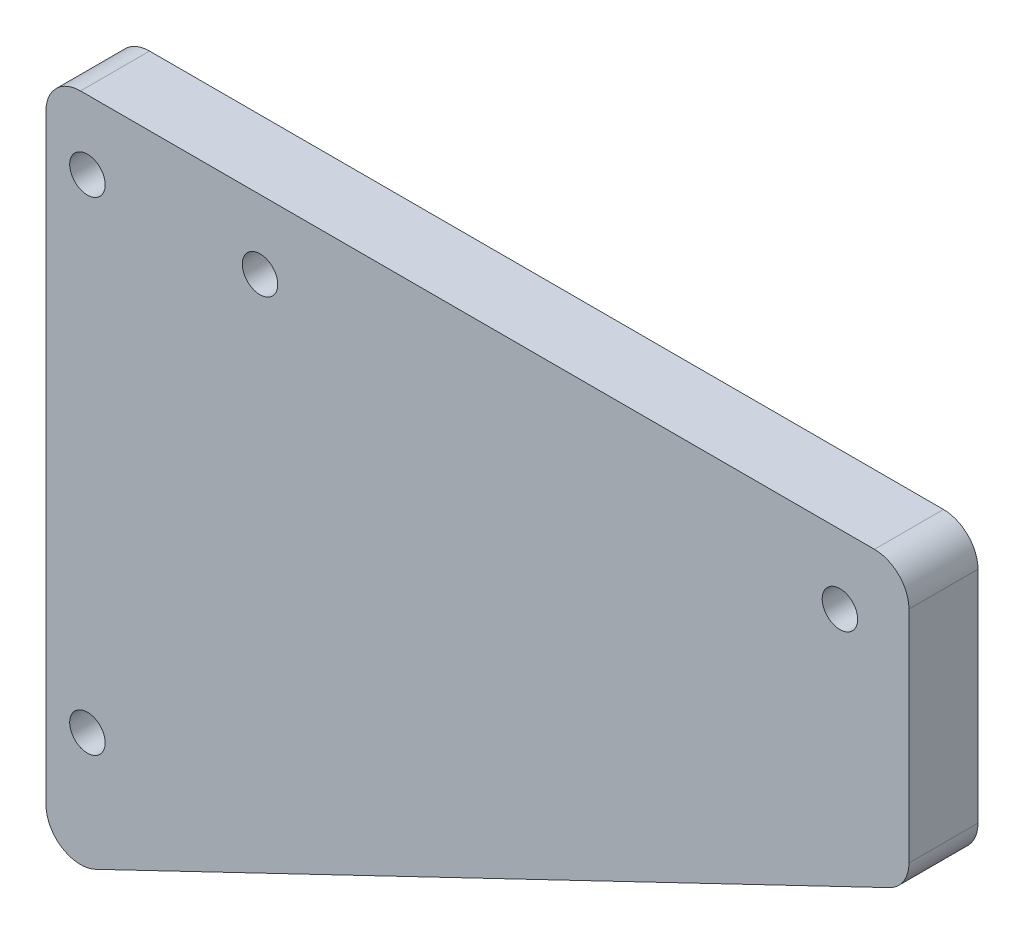
ISO-10303-21;
HEADER;
FILE_DESCRIPTION(('STEP AP214'),'2;1');
FILE_NAME('part.step','',(''),(''),'','','');
FILE_SCHEMA(('AUTOMOTIVE_DESIGN { 1 0 10303 214 1 1 1 1 }'));
ENDSEC;
DATA;
#1=APPLICATION_CONTEXT('core data for automotive mechanical design processes');
#2=APPLICATION_PROTOCOL_DEFINITION('international standard','automotive_design',2000,#1);
#3=PRODUCT_CONTEXT('',#1,'mechanical');
#4=PRODUCT('Part','Part','',(#3));
#5=PRODUCT_RELATED_PRODUCT_CATEGORY('part','',(#4));
#6=PRODUCT_DEFINITION_FORMATION('','',#4);
#7=PRODUCT_DEFINITION_CONTEXT('part definition',#1,'design');
#8=PRODUCT_DEFINITION('design','',#6,#7);
#9=PRODUCT_DEFINITION_SHAPE('','',#8);
#10=(LENGTH_UNIT() NAMED_UNIT(*) SI_UNIT(.MILLI.,.METRE.));
#11=(NAMED_UNIT(*) PLANE_ANGLE_UNIT() SI_UNIT($,.RADIAN.));
#12=(NAMED_UNIT(*) SI_UNIT($,.STERADIAN.) SOLID_ANGLE_UNIT());
#13=UNCERTAINTY_MEASURE_WITH_UNIT(LENGTH_MEASURE(1.E-05),#10,'distance_accuracy_value','');
#14=(GEOMETRIC_REPRESENTATION_CONTEXT(3) GLOBAL_UNCERTAINTY_ASSIGNED_CONTEXT((#13)) GLOBAL_UNIT_ASSIGNED_CONTEXT((#10,
#11,#12)) REPRESENTATION_CONTEXT('',''));
#15=CARTESIAN_POINT('',(0.,0.,0.));
#16=DIRECTION('',(0.,0.,1.));
#17=DIRECTION('',(1.,0.,0.));
#18=AXIS2_PLACEMENT_3D('',#15,#16,#17);
#19=CARTESIAN_POINT('',(41.275,-19.05,6.35));
#20=DIRECTION('',(-1.,0.,0.));
#21=DIRECTION('',(0.,-1.,0.));
#22=AXIS2_PLACEMENT_3D('',#19,#20,#21);
#23=PLANE('',#22);
#24=DIRECTION('',(0.,1.,0.));
#25=VECTOR('',#24,1.);
#26=CARTESIAN_POINT('',(41.275,-19.05,6.35));
#27=LINE('',#26,#25);
#28=CARTESIAN_POINT('',(41.275,-17.052182145539,6.35));
#29=VERTEX_POINT('',#28);
#30=CARTESIAN_POINT('',(41.275,3.175,6.35));
#31=VERTEX_POINT('',#30);
#32=EDGE_CURVE('E127',#29,#31,#27,.T.);
#33=ORIENTED_EDGE('',*,*,#32,.F.);
#34=DIRECTION('',(0.,0.,-1.));
#35=VECTOR('',#34,1.);
#36=CARTESIAN_POINT('',(41.275,-17.052182145539,6.35));
#37=LINE('',#36,#35);
#38=CARTESIAN_POINT('',(41.275,-17.052182145539,0.));
#39=VERTEX_POINT('',#38);
#40=EDGE_CURVE('E11',#29,#39,#37,.T.);
#41=ORIENTED_EDGE('',*,*,#40,.T.);
#42=DIRECTION('',(0.,1.,0.));
#43=VECTOR('',#42,1.);
#44=CARTESIAN_POINT('',(41.275,-19.05,0.));
#45=LINE('',#44,#43);
#46=CARTESIAN_POINT('',(41.275,3.175,0.));
#47=VERTEX_POINT('',#46);
#48=EDGE_CURVE('E168',#39,#47,#45,.T.);
#49=ORIENTED_EDGE('',*,*,#48,.T.);
#50=DIRECTION('',(0.,0.,-1.));
#51=VECTOR('',#50,1.);
#52=CARTESIAN_POINT('',(41.275,3.175,6.35));
#53=LINE('',#52,#51);
#54=EDGE_CURVE('E41',#47,#31,#53,.F.);
#55=ORIENTED_EDGE('',*,*,#54,.T.);
#56=EDGE_LOOP('',(#33,#41,#49,#55));
#57=FACE_BOUND('',#56,.T.);
#58=ADVANCED_FACE('F33',(#57),#23,.F.);
#59=CARTESIAN_POINT('',(-38.1,6.35,6.35));
#60=DIRECTION('',(0.,-1.,0.));
#61=DIRECTION('',(1.,0.,0.));
#62=AXIS2_PLACEMENT_3D('',#59,#60,#61);
#63=PLANE('',#62);
#64=DIRECTION('',(-1.,0.,0.));
#65=VECTOR('',#64,1.);
#66=CARTESIAN_POINT('',(-38.1,6.35,0.));
#67=LINE('',#66,#65);
#68=CARTESIAN_POINT('',(38.1,6.35,0.));
#69=VERTEX_POINT('',#68);
#70=CARTESIAN_POINT('',(-34.925,6.35,0.));
#71=VERTEX_POINT('',#70);
#72=EDGE_CURVE('E132',#69,#71,#67,.T.);
#73=ORIENTED_EDGE('',*,*,#72,.T.);
#74=DIRECTION('',(0.,0.,-1.));
#75=VECTOR('',#74,1.);
#76=CARTESIAN_POINT('',(-34.925,6.35,6.35));
#77=LINE('',#76,#75);
#78=CARTESIAN_POINT('',(-34.925,6.35,6.35));
#79=VERTEX_POINT('',#78);
#80=EDGE_CURVE('E48',#71,#79,#77,.F.);
#81=ORIENTED_EDGE('',*,*,#80,.T.);
#82=DIRECTION('',(-1.,0.,0.));
#83=VECTOR('',#82,1.);
#84=CARTESIAN_POINT('',(-38.1,6.35,6.35));
#85=LINE('',#84,#83);
#86=CARTESIAN_POINT('',(38.1,6.35,6.35));
#87=VERTEX_POINT('',#86);
#88=EDGE_CURVE('E130',#87,#79,#85,.T.);
#89=ORIENTED_EDGE('',*,*,#88,.F.);
#90=DIRECTION('',(0.,0.,-1.));
#91=VECTOR('',#90,1.);
#92=CARTESIAN_POINT('',(38.1,6.35,6.35));
#93=LINE('',#92,#91);
#94=EDGE_CURVE('E160',#87,#69,#93,.T.);
#95=ORIENTED_EDGE('',*,*,#94,.T.);
#96=EDGE_LOOP('',(#73,#81,#89,#95));
#97=FACE_BOUND('',#96,.T.);
#98=ADVANCED_FACE('F175',(#97),#63,.F.);
#99=CARTESIAN_POINT('',(-38.1,-57.15,6.35));
#100=DIRECTION('',(1.,0.,0.));
#101=DIRECTION('',(0.,1.,0.));
#102=AXIS2_PLACEMENT_3D('',#99,#100,#101);
#103=PLANE('',#102);
#104=DIRECTION('',(0.,-1.,0.));
#105=VECTOR('',#104,1.);
#106=CARTESIAN_POINT('',(-38.1,-57.15,0.));
#107=LINE('',#106,#105);
#108=CARTESIAN_POINT('',(-38.1,3.175,0.));
#109=VERTEX_POINT('',#108);
#110=CARTESIAN_POINT('',(-38.1,-52.104182145539,0.));
#111=VERTEX_POINT('',#110);
#112=EDGE_CURVE('E128',#109,#111,#107,.T.);
#113=ORIENTED_EDGE('',*,*,#112,.T.);
#114=DIRECTION('',(0.,0.,-1.));
#115=VECTOR('',#114,1.);
#116=CARTESIAN_POINT('',(-38.1,-52.104182145539,6.35));
#117=LINE('',#116,#115);
#118=CARTESIAN_POINT('',(-38.1,-52.104182145539,6.35));
#119=VERTEX_POINT('',#118);
#120=EDGE_CURVE('E105',#111,#119,#117,.F.);
#121=ORIENTED_EDGE('',*,*,#120,.T.);
#122=DIRECTION('',(0.,-1.,0.));
#123=VECTOR('',#122,1.);
#124=CARTESIAN_POINT('',(-38.1,-57.15,6.35));
#125=LINE('',#124,#123);
#126=CARTESIAN_POINT('',(-38.1,3.175,6.35));
#127=VERTEX_POINT('',#126);
#128=EDGE_CURVE('E180',#127,#119,#125,.T.);
#129=ORIENTED_EDGE('',*,*,#128,.F.);
#130=DIRECTION('',(0.,0.,-1.));
#131=VECTOR('',#130,1.);
#132=CARTESIAN_POINT('',(-38.1,3.175,6.35));
#133=LINE('',#132,#131);
#134=EDGE_CURVE('E110',#127,#109,#133,.T.);
#135=ORIENTED_EDGE('',*,*,#134,.T.);
#136=EDGE_LOOP('',(#113,#121,#129,#135));
#137=FACE_BOUND('',#136,.T.);
#138=ADVANCED_FACE('F227',(#137),#103,.F.);
#139=CARTESIAN_POINT('',(-38.1,-57.15,6.35));
#140=DIRECTION('',(-0.432731067584771,0.901523057468274,0.));
#141=DIRECTION('',(-0.901523057468274,-0.432731067584771,0.));
#142=AXIS2_PLACEMENT_3D('',#139,#140,#141);
#143=PLANE('',#142);
#144=DIRECTION('',(0.901523057468274,0.432731067584771,0.));
#145=VECTOR('',#144,1.);
#146=CARTESIAN_POINT('',(-38.1,-57.15,6.35));
#147=LINE('',#146,#145);
#148=CARTESIAN_POINT('',(-33.5510788604183,-54.9665178530008,6.35));
#149=VERTEX_POINT('',#148);
#150=CARTESIAN_POINT('',(39.4739211395817,-19.9145178530008,6.35));
#151=VERTEX_POINT('',#150);
#152=EDGE_CURVE('E120',#149,#151,#147,.T.);
#153=ORIENTED_EDGE('',*,*,#152,.F.);
#154=DIRECTION('',(0.,0.,-1.));
#155=VECTOR('',#154,1.);
#156=CARTESIAN_POINT('',(-33.5510788604183,-54.9665178530008,6.35));
#157=LINE('',#156,#155);
#158=CARTESIAN_POINT('',(-33.5510788604183,-54.9665178530008,0.));
#159=VERTEX_POINT('',#158);
#160=EDGE_CURVE('E104',#149,#159,#157,.T.);
#161=ORIENTED_EDGE('',*,*,#160,.T.);
#162=DIRECTION('',(0.901523057468274,0.432731067584771,0.));
#163=VECTOR('',#162,1.);
#164=CARTESIAN_POINT('',(-38.1,-57.15,0.));
#165=LINE('',#164,#163);
#166=CARTESIAN_POINT('',(39.4739211395817,-19.9145178530008,0.));
#167=VERTEX_POINT('',#166);
#168=EDGE_CURVE('E117',#159,#167,#165,.T.);
#169=ORIENTED_EDGE('',*,*,#168,.T.);
#170=DIRECTION('',(0.,0.,-1.));
#171=VECTOR('',#170,1.);
#172=CARTESIAN_POINT('',(39.4739211395817,-19.9145178530008,6.35));
#173=LINE('',#172,#171);
#174=EDGE_CURVE('E122',#167,#151,#173,.F.);
#175=ORIENTED_EDGE('',*,*,#174,.T.);
#176=EDGE_LOOP('',(#153,#161,#169,#175));
#177=FACE_BOUND('',#176,.T.);
#178=ADVANCED_FACE('F116',(#177),#143,.F.);
#179=CARTESIAN_POINT('',(41.275,6.35,6.35));
#180=DIRECTION('',(0.,0.,-1.));
#181=DIRECTION('',(-1.,0.,0.));
#182=AXIS2_PLACEMENT_3D('',#179,#180,#181);
#183=PLANE('',#182);
#184=CARTESIAN_POINT('',(-34.29,0.,6.35));
#185=DIRECTION('',(0.,0.,1.));
#186=DIRECTION('',(1.,0.,0.));
#187=AXIS2_PLACEMENT_3D('',#184,#185,#186);
#188=CIRCLE('',#187,1.63194999999999);
#189=CARTESIAN_POINT('',(-32.65805,0.,6.35));
#190=VERTEX_POINT('',#189);
#191=EDGE_CURVE('E145',#190,#190,#188,.T.);
#192=ORIENTED_EDGE('',*,*,#191,.F.);
#193=EDGE_LOOP('',(#192));
#194=FACE_BOUND('',#193,.T.);
#195=CARTESIAN_POINT('',(-18.415,0.,6.35));
#196=DIRECTION('',(0.,0.,1.));
#197=DIRECTION('',(1.,0.,0.));
#198=AXIS2_PLACEMENT_3D('',#195,#196,#197);
#199=CIRCLE('',#198,1.63194999999999);
#200=CARTESIAN_POINT('',(-16.78305,0.,6.35));
#201=VERTEX_POINT('',#200);
#202=EDGE_CURVE('E144',#201,#201,#199,.T.);
#203=ORIENTED_EDGE('',*,*,#202,.F.);
#204=EDGE_LOOP('',(#203));
#205=FACE_BOUND('',#204,.T.);
#206=CARTESIAN_POINT('',(34.925,0.,6.35));
#207=DIRECTION('',(0.,0.,1.));
#208=DIRECTION('',(1.,0.,0.));
#209=AXIS2_PLACEMENT_3D('',#206,#207,#208);
#210=CIRCLE('',#209,1.63194999999999);
#211=CARTESIAN_POINT('',(36.55695,0.,6.35));
#212=VERTEX_POINT('',#211);
#213=EDGE_CURVE('E140',#212,#212,#210,.T.);
#214=ORIENTED_EDGE('',*,*,#213,.F.);
#215=EDGE_LOOP('',(#214));
#216=FACE_BOUND('',#215,.T.);
#217=CARTESIAN_POINT('',(-34.29,-44.45,6.35));
#218=DIRECTION('',(0.,0.,1.));
#219=DIRECTION('',(1.,0.,0.));
#220=AXIS2_PLACEMENT_3D('',#217,#218,#219);
#221=CIRCLE('',#220,1.63194999999999);
#222=CARTESIAN_POINT('',(-32.65805,-44.45,6.35));
#223=VERTEX_POINT('',#222);
#224=EDGE_CURVE('E139',#223,#223,#221,.T.);
#225=ORIENTED_EDGE('',*,*,#224,.F.);
#226=EDGE_LOOP('',(#225));
#227=FACE_BOUND('',#226,.T.);
#228=ORIENTED_EDGE('',*,*,#128,.T.);
#229=CARTESIAN_POINT('',(-34.925,-52.104182145539,6.35));
#230=DIRECTION('',(0.,0.,-1.));
#231=DIRECTION('',(-1.,0.,0.));
#232=AXIS2_PLACEMENT_3D('',#229,#230,#231);
#233=CIRCLE('',#232,3.175);
#234=EDGE_CURVE('E158',#119,#149,#233,.F.);
#235=ORIENTED_EDGE('',*,*,#234,.T.);
#236=ORIENTED_EDGE('',*,*,#152,.T.);
#237=CARTESIAN_POINT('',(38.1,-17.052182145539,6.35));
#238=DIRECTION('',(0.,0.,-1.));
#239=DIRECTION('',(-1.,0.,0.));
#240=AXIS2_PLACEMENT_3D('',#237,#238,#239);
#241=CIRCLE('',#240,3.175);
#242=EDGE_CURVE('E154',#151,#29,#241,.F.);
#243=ORIENTED_EDGE('',*,*,#242,.T.);
#244=ORIENTED_EDGE('',*,*,#32,.T.);
#245=CARTESIAN_POINT('',(38.1,3.175,6.35));
#246=DIRECTION('',(0.,0.,-1.));
#247=DIRECTION('',(-1.,0.,0.));
#248=AXIS2_PLACEMENT_3D('',#245,#246,#247);
#249=CIRCLE('',#248,3.175);
#250=EDGE_CURVE('E55',#31,#87,#249,.F.);
#251=ORIENTED_EDGE('',*,*,#250,.T.);
#252=ORIENTED_EDGE('',*,*,#88,.T.);
#253=CARTESIAN_POINT('',(-34.925,3.175,6.35));
#254=DIRECTION('',(0.,0.,-1.));
#255=DIRECTION('',(-1.,0.,0.));
#256=AXIS2_PLACEMENT_3D('',#253,#254,#255);
#257=CIRCLE('',#256,3.175);
#258=EDGE_CURVE('E156',#79,#127,#257,.F.);
#259=ORIENTED_EDGE('',*,*,#258,.T.);
#260=EDGE_LOOP('',(#228,#235,#236,#243,#244,#251,#252,#259));
#261=FACE_BOUND('',#260,.T.);
#262=ADVANCED_FACE('F171',(#194,#205,#216,#227,#261),#183,.F.);
#263=CARTESIAN_POINT('',(41.275,6.35,0.));
#264=DIRECTION('',(0.,0.,-1.));
#265=DIRECTION('',(-1.,0.,0.));
#266=AXIS2_PLACEMENT_3D('',#263,#264,#265);
#267=PLANE('',#266);
#268=CARTESIAN_POINT('',(-34.29,0.,0.));
#269=DIRECTION('',(0.,0.,-1.));
#270=DIRECTION('',(-1.,0.,0.));
#271=AXIS2_PLACEMENT_3D('',#268,#269,#270);
#272=CIRCLE('',#271,1.63194999999999);
#273=CARTESIAN_POINT('',(-35.92195,0.,0.));
#274=VERTEX_POINT('',#273);
#275=EDGE_CURVE('E141',#274,#274,#272,.T.);
#276=ORIENTED_EDGE('',*,*,#275,.F.);
#277=EDGE_LOOP('',(#276));
#278=FACE_BOUND('',#277,.T.);
#279=CARTESIAN_POINT('',(-18.415,0.,0.));
#280=DIRECTION('',(0.,0.,-1.));
#281=DIRECTION('',(-1.,0.,0.));
#282=AXIS2_PLACEMENT_3D('',#279,#280,#281);
#283=CIRCLE('',#282,1.63194999999999);
#284=CARTESIAN_POINT('',(-20.04695,0.,0.));
#285=VERTEX_POINT('',#284);
#286=EDGE_CURVE('E189',#285,#285,#283,.T.);
#287=ORIENTED_EDGE('',*,*,#286,.F.);
#288=EDGE_LOOP('',(#287));
#289=FACE_BOUND('',#288,.T.);
#290=CARTESIAN_POINT('',(34.925,0.,0.));
#291=DIRECTION('',(0.,0.,-1.));
#292=DIRECTION('',(-1.,0.,0.));
#293=AXIS2_PLACEMENT_3D('',#290,#291,#292);
#294=CIRCLE('',#293,1.63194999999999);
#295=CARTESIAN_POINT('',(33.29305,0.,0.));
#296=VERTEX_POINT('',#295);
#297=EDGE_CURVE('E136',#296,#296,#294,.T.);
#298=ORIENTED_EDGE('',*,*,#297,.F.);
#299=EDGE_LOOP('',(#298));
#300=FACE_BOUND('',#299,.T.);
#301=CARTESIAN_POINT('',(-34.29,-44.45,0.));
#302=DIRECTION('',(0.,0.,-1.));
#303=DIRECTION('',(-1.,0.,0.));
#304=AXIS2_PLACEMENT_3D('',#301,#302,#303);
#305=CIRCLE('',#304,1.63194999999999);
#306=CARTESIAN_POINT('',(-35.92195,-44.45,0.));
#307=VERTEX_POINT('',#306);
#308=EDGE_CURVE('E176',#307,#307,#305,.T.);
#309=ORIENTED_EDGE('',*,*,#308,.F.);
#310=EDGE_LOOP('',(#309));
#311=FACE_BOUND('',#310,.T.);
#312=ORIENTED_EDGE('',*,*,#168,.F.);
#313=CARTESIAN_POINT('',(-34.925,-52.104182145539,0.));
#314=DIRECTION('',(0.,0.,-1.));
#315=DIRECTION('',(-1.,0.,0.));
#316=AXIS2_PLACEMENT_3D('',#313,#314,#315);
#317=CIRCLE('',#316,3.175);
#318=EDGE_CURVE('E100',#159,#111,#317,.T.);
#319=ORIENTED_EDGE('',*,*,#318,.T.);
#320=ORIENTED_EDGE('',*,*,#112,.F.);
#321=CARTESIAN_POINT('',(-34.925,3.175,0.));
#322=DIRECTION('',(0.,0.,-1.));
#323=DIRECTION('',(-1.,0.,0.));
#324=AXIS2_PLACEMENT_3D('',#321,#322,#323);
#325=CIRCLE('',#324,3.175);
#326=EDGE_CURVE('E111',#109,#71,#325,.T.);
#327=ORIENTED_EDGE('',*,*,#326,.T.);
#328=ORIENTED_EDGE('',*,*,#72,.F.);
#329=CARTESIAN_POINT('',(38.1,3.175,0.));
#330=DIRECTION('',(0.,0.,-1.));
#331=DIRECTION('',(-1.,0.,0.));
#332=AXIS2_PLACEMENT_3D('',#329,#330,#331);
#333=CIRCLE('',#332,3.175);
#334=EDGE_CURVE('E121',#69,#47,#333,.T.);
#335=ORIENTED_EDGE('',*,*,#334,.T.);
#336=ORIENTED_EDGE('',*,*,#48,.F.);
#337=CARTESIAN_POINT('',(38.1,-17.052182145539,0.));
#338=DIRECTION('',(0.,0.,-1.));
#339=DIRECTION('',(-1.,0.,0.));
#340=AXIS2_PLACEMENT_3D('',#337,#338,#339);
#341=CIRCLE('',#340,3.175);
#342=EDGE_CURVE('E126',#39,#167,#341,.T.);
#343=ORIENTED_EDGE('',*,*,#342,.T.);
#344=EDGE_LOOP('',(#312,#319,#320,#327,#328,#335,#336,#343));
#345=FACE_BOUND('',#344,.T.);
#346=ADVANCED_FACE('F124',(#278,#289,#300,#311,#345),#267,.T.);
#347=CARTESIAN_POINT('',(-34.29,-44.45,6.35));
#348=DIRECTION('',(0.,0.,1.));
#349=DIRECTION('',(1.,0.,0.));
#350=AXIS2_PLACEMENT_3D('',#347,#348,#349);
#351=CYLINDRICAL_SURFACE('',#350,1.63194999999999);
#352=ORIENTED_EDGE('',*,*,#308,.T.);
#353=EDGE_LOOP('',(#352));
#354=FACE_BOUND('',#353,.T.);
#355=ORIENTED_EDGE('',*,*,#224,.T.);
#356=EDGE_LOOP('',(#355));
#357=FACE_BOUND('',#356,.T.);
#358=ADVANCED_FACE('F208',(#354,#357),#351,.F.);
#359=CARTESIAN_POINT('',(34.925,0.,6.35));
#360=DIRECTION('',(0.,0.,1.));
#361=DIRECTION('',(1.,0.,0.));
#362=AXIS2_PLACEMENT_3D('',#359,#360,#361);
#363=CYLINDRICAL_SURFACE('',#362,1.63194999999999);
#364=ORIENTED_EDGE('',*,*,#297,.T.);
#365=EDGE_LOOP('',(#364));
#366=FACE_BOUND('',#365,.T.);
#367=ORIENTED_EDGE('',*,*,#213,.T.);
#368=EDGE_LOOP('',(#367));
#369=FACE_BOUND('',#368,.T.);
#370=ADVANCED_FACE('F210',(#366,#369),#363,.F.);
#371=CARTESIAN_POINT('',(-18.415,0.,6.35));
#372=DIRECTION('',(0.,0.,1.));
#373=DIRECTION('',(1.,0.,0.));
#374=AXIS2_PLACEMENT_3D('',#371,#372,#373);
#375=CYLINDRICAL_SURFACE('',#374,1.63194999999999);
#376=ORIENTED_EDGE('',*,*,#286,.T.);
#377=EDGE_LOOP('',(#376));
#378=FACE_BOUND('',#377,.T.);
#379=ORIENTED_EDGE('',*,*,#202,.T.);
#380=EDGE_LOOP('',(#379));
#381=FACE_BOUND('',#380,.T.);
#382=ADVANCED_FACE('F217',(#378,#381),#375,.F.);
#383=CARTESIAN_POINT('',(-34.29,0.,6.35));
#384=DIRECTION('',(0.,0.,1.));
#385=DIRECTION('',(1.,0.,0.));
#386=AXIS2_PLACEMENT_3D('',#383,#384,#385);
#387=CYLINDRICAL_SURFACE('',#386,1.63194999999999);
#388=ORIENTED_EDGE('',*,*,#275,.T.);
#389=EDGE_LOOP('',(#388));
#390=FACE_BOUND('',#389,.T.);
#391=ORIENTED_EDGE('',*,*,#191,.T.);
#392=EDGE_LOOP('',(#391));
#393=FACE_BOUND('',#392,.T.);
#394=ADVANCED_FACE('F197',(#390,#393),#387,.F.);
#395=CARTESIAN_POINT('',(-34.925,-52.104182145539,6.35));
#396=DIRECTION('',(0.,0.,-1.));
#397=DIRECTION('',(-1.,0.,0.));
#398=AXIS2_PLACEMENT_3D('',#395,#396,#397);
#399=CYLINDRICAL_SURFACE('',#398,3.175);
#400=ORIENTED_EDGE('',*,*,#234,.F.);
#401=ORIENTED_EDGE('',*,*,#120,.F.);
#402=ORIENTED_EDGE('',*,*,#318,.F.);
#403=ORIENTED_EDGE('',*,*,#160,.F.);
#404=EDGE_LOOP('',(#400,#401,#402,#403));
#405=FACE_BOUND('',#404,.T.);
#406=ADVANCED_FACE('F103',(#405),#399,.T.);
#407=CARTESIAN_POINT('',(-34.925,3.175,6.35));
#408=DIRECTION('',(0.,0.,-1.));
#409=DIRECTION('',(-1.,0.,0.));
#410=AXIS2_PLACEMENT_3D('',#407,#408,#409);
#411=CYLINDRICAL_SURFACE('',#410,3.175);
#412=ORIENTED_EDGE('',*,*,#258,.F.);
#413=ORIENTED_EDGE('',*,*,#80,.F.);
#414=ORIENTED_EDGE('',*,*,#326,.F.);
#415=ORIENTED_EDGE('',*,*,#134,.F.);
#416=EDGE_LOOP('',(#412,#413,#414,#415));
#417=FACE_BOUND('',#416,.T.);
#418=ADVANCED_FACE('F233',(#417),#411,.T.);
#419=CARTESIAN_POINT('',(38.1,-17.052182145539,6.35));
#420=DIRECTION('',(0.,0.,-1.));
#421=DIRECTION('',(-1.,0.,0.));
#422=AXIS2_PLACEMENT_3D('',#419,#420,#421);
#423=CYLINDRICAL_SURFACE('',#422,3.175);
#424=ORIENTED_EDGE('',*,*,#242,.F.);
#425=ORIENTED_EDGE('',*,*,#174,.F.);
#426=ORIENTED_EDGE('',*,*,#342,.F.);
#427=ORIENTED_EDGE('',*,*,#40,.F.);
#428=EDGE_LOOP('',(#424,#425,#426,#427));
#429=FACE_BOUND('',#428,.T.);
#430=ADVANCED_FACE('F235',(#429),#423,.T.);
#431=CARTESIAN_POINT('',(38.1,3.175,6.35));
#432=DIRECTION('',(0.,0.,-1.));
#433=DIRECTION('',(-1.,0.,0.));
#434=AXIS2_PLACEMENT_3D('',#431,#432,#433);
#435=CYLINDRICAL_SURFACE('',#434,3.175);
#436=ORIENTED_EDGE('',*,*,#250,.F.);
#437=ORIENTED_EDGE('',*,*,#54,.F.);
#438=ORIENTED_EDGE('',*,*,#334,.F.);
#439=ORIENTED_EDGE('',*,*,#94,.F.);
#440=EDGE_LOOP('',(#436,#437,#438,#439));
#441=FACE_BOUND('',#440,.T.);
#442=ADVANCED_FACE('F35',(#441),#435,.T.);
#443=CLOSED_SHELL('',(#58,#98,#138,#178,#262,#346,#358,#370,#382,#394,#406,#418,#430,#442));
#444=MANIFOLD_SOLID_BREP('B2',#443);
#445=ADVANCED_BREP_SHAPE_REPRESENTATION('',(#18,#444),#14);
#446=SHAPE_DEFINITION_REPRESENTATION(#9,#445);
ENDSEC;
END-ISO-10303-21;
